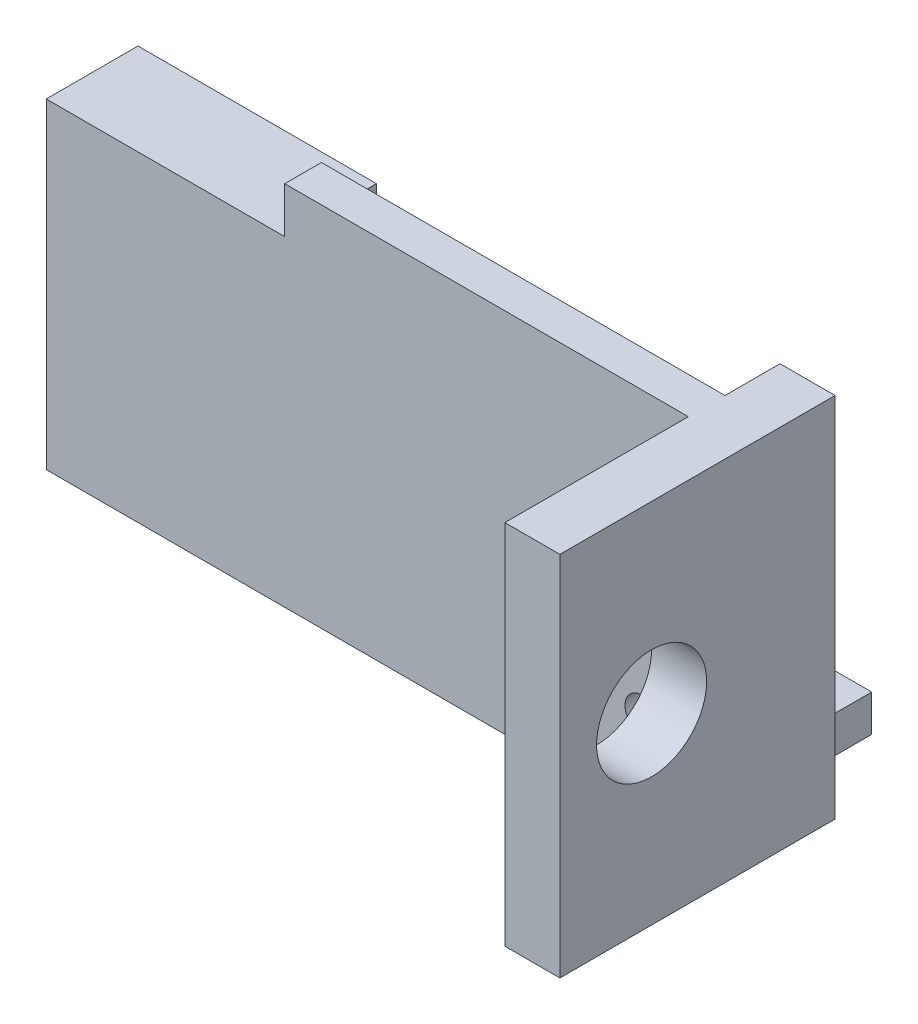
ISO-10303-21;
HEADER;
FILE_DESCRIPTION(('STEP AP214'),'2;1');
FILE_NAME('part.step','',(''),(''),'','','');
FILE_SCHEMA(('AUTOMOTIVE_DESIGN { 1 0 10303 214 1 1 1 1 }'));
ENDSEC;
DATA;
#1=APPLICATION_CONTEXT('core data for automotive mechanical design processes');
#2=APPLICATION_PROTOCOL_DEFINITION('international standard','automotive_design',2000,#1);
#3=PRODUCT_CONTEXT('',#1,'mechanical');
#4=PRODUCT('Part','Part','',(#3));
#5=PRODUCT_RELATED_PRODUCT_CATEGORY('part','',(#4));
#6=PRODUCT_DEFINITION_FORMATION('','',#4);
#7=PRODUCT_DEFINITION_CONTEXT('part definition',#1,'design');
#8=PRODUCT_DEFINITION('design','',#6,#7);
#9=PRODUCT_DEFINITION_SHAPE('','',#8);
#10=(LENGTH_UNIT() NAMED_UNIT(*) SI_UNIT(.MILLI.,.METRE.));
#11=(NAMED_UNIT(*) PLANE_ANGLE_UNIT() SI_UNIT($,.RADIAN.));
#12=(NAMED_UNIT(*) SI_UNIT($,.STERADIAN.) SOLID_ANGLE_UNIT());
#13=UNCERTAINTY_MEASURE_WITH_UNIT(LENGTH_MEASURE(1.E-05),#10,'distance_accuracy_value','');
#14=(GEOMETRIC_REPRESENTATION_CONTEXT(3) GLOBAL_UNCERTAINTY_ASSIGNED_CONTEXT((#13)) GLOBAL_UNIT_ASSIGNED_CONTEXT((#10,
#11,#12)) REPRESENTATION_CONTEXT('',''));
#15=CARTESIAN_POINT('',(0.,0.,0.));
#16=DIRECTION('',(0.,0.,1.));
#17=DIRECTION('',(1.,0.,0.));
#18=AXIS2_PLACEMENT_3D('',#15,#16,#17);
#19=CARTESIAN_POINT('',(17.5,9.,2.));
#20=DIRECTION('',(-1.,0.,0.));
#21=DIRECTION('',(0.,0.,1.));
#22=AXIS2_PLACEMENT_3D('',#19,#20,#21);
#23=PLANE('',#22);
#24=DIRECTION('',(0.,1.,0.));
#25=VECTOR('',#24,1.);
#26=CARTESIAN_POINT('',(17.5,9.,-3.));
#27=LINE('',#26,#25);
#28=CARTESIAN_POINT('',(17.5,-11.,-3.));
#29=VERTEX_POINT('',#28);
#30=CARTESIAN_POINT('',(17.5,-9.,-3.));
#31=VERTEX_POINT('',#30);
#32=EDGE_CURVE('E262',#29,#31,#27,.T.);
#33=ORIENTED_EDGE('',*,*,#32,.F.);
#34=DIRECTION('',(0.,0.,1.));
#35=VECTOR('',#34,1.);
#36=CARTESIAN_POINT('',(17.5,-11.,2.));
#37=LINE('',#36,#35);
#38=CARTESIAN_POINT('',(17.5,-11.,-8.));
#39=VERTEX_POINT('',#38);
#40=EDGE_CURVE('E222',#39,#29,#37,.T.);
#41=ORIENTED_EDGE('',*,*,#40,.F.);
#42=DIRECTION('',(0.,1.,0.));
#43=VECTOR('',#42,1.);
#44=CARTESIAN_POINT('',(17.5,-11.,-8.));
#45=LINE('',#44,#43);
#46=CARTESIAN_POINT('',(17.5,-9.,-8.));
#47=VERTEX_POINT('',#46);
#48=EDGE_CURVE('E215',#39,#47,#45,.T.);
#49=ORIENTED_EDGE('',*,*,#48,.T.);
#50=DIRECTION('',(0.,0.,1.));
#51=VECTOR('',#50,1.);
#52=CARTESIAN_POINT('',(17.5,-9.,2.));
#53=LINE('',#52,#51);
#54=EDGE_CURVE('E226',#47,#31,#53,.T.);
#55=ORIENTED_EDGE('',*,*,#54,.T.);
#56=EDGE_LOOP('',(#33,#41,#49,#55));
#57=FACE_BOUND('',#56,.T.);
#58=ADVANCED_FACE('F41',(#57),#23,.F.);
#59=CARTESIAN_POINT('',(0.,0.,0.));
#60=DIRECTION('',(0.,0.,1.));
#61=DIRECTION('',(1.,0.,0.));
#62=AXIS2_PLACEMENT_3D('',#59,#60,#61);
#63=PLANE('',#62);
#64=DIRECTION('',(0.,-1.,0.));
#65=VECTOR('',#64,1.);
#66=CARTESIAN_POINT('',(-4.5,6.5,0.));
#67=LINE('',#66,#65);
#68=CARTESIAN_POINT('',(-4.5,6.5,0.));
#69=VERTEX_POINT('',#68);
#70=CARTESIAN_POINT('',(-4.5,3.,0.));
#71=VERTEX_POINT('',#70);
#72=EDGE_CURVE('E144',#69,#71,#67,.T.);
#73=ORIENTED_EDGE('',*,*,#72,.F.);
#74=DIRECTION('',(0.,-1.,0.));
#75=VECTOR('',#74,1.);
#76=CARTESIAN_POINT('',(-4.5,6.5,0.));
#77=LINE('',#76,#75);
#78=CARTESIAN_POINT('',(-4.5,9.,0.));
#79=VERTEX_POINT('',#78);
#80=EDGE_CURVE('E185',#79,#69,#77,.T.);
#81=ORIENTED_EDGE('',*,*,#80,.F.);
#82=DIRECTION('',(-1.,0.,0.));
#83=VECTOR('',#82,1.);
#84=CARTESIAN_POINT('',(-4.5,9.,0.));
#85=LINE('',#84,#83);
#86=CARTESIAN_POINT('',(17.5,9.,0.));
#87=VERTEX_POINT('',#86);
#88=EDGE_CURVE('E76',#87,#79,#85,.T.);
#89=ORIENTED_EDGE('',*,*,#88,.F.);
#90=DIRECTION('',(0.,1.,0.));
#91=VECTOR('',#90,1.);
#92=CARTESIAN_POINT('',(17.5,9.,0.));
#93=LINE('',#92,#91);
#94=CARTESIAN_POINT('',(17.5,-4.,0.));
#95=VERTEX_POINT('',#94);
#96=EDGE_CURVE('E171',#95,#87,#93,.T.);
#97=ORIENTED_EDGE('',*,*,#96,.F.);
#98=DIRECTION('',(1.,0.,0.));
#99=VECTOR('',#98,1.);
#100=CARTESIAN_POINT('',(17.5,-4.,0.));
#101=LINE('',#100,#99);
#102=CARTESIAN_POINT('',(9.50000000000001,-4.,0.));
#103=VERTEX_POINT('',#102);
#104=EDGE_CURVE('E98',#103,#95,#101,.T.);
#105=ORIENTED_EDGE('',*,*,#104,.F.);
#106=DIRECTION('',(0.,1.,0.));
#107=VECTOR('',#106,1.);
#108=CARTESIAN_POINT('',(9.50000000000001,-9.,0.));
#109=LINE('',#108,#107);
#110=CARTESIAN_POINT('',(9.50000000000001,-9.,0.));
#111=VERTEX_POINT('',#110);
#112=EDGE_CURVE('E151',#111,#103,#109,.T.);
#113=ORIENTED_EDGE('',*,*,#112,.F.);
#114=DIRECTION('',(1.,0.,0.));
#115=VECTOR('',#114,1.);
#116=CARTESIAN_POINT('',(-17.5,-9.,0.));
#117=LINE('',#116,#115);
#118=CARTESIAN_POINT('',(-17.5,-9.,0.));
#119=VERTEX_POINT('',#118);
#120=EDGE_CURVE('E176',#119,#111,#117,.T.);
#121=ORIENTED_EDGE('',*,*,#120,.F.);
#122=DIRECTION('',(0.,-1.,0.));
#123=VECTOR('',#122,1.);
#124=CARTESIAN_POINT('',(-17.5,6.5,0.));
#125=LINE('',#124,#123);
#126=CARTESIAN_POINT('',(-17.5,3.,0.));
#127=VERTEX_POINT('',#126);
#128=EDGE_CURVE('E188',#127,#119,#125,.T.);
#129=ORIENTED_EDGE('',*,*,#128,.F.);
#130=DIRECTION('',(-1.,0.,0.));
#131=VECTOR('',#130,1.);
#132=CARTESIAN_POINT('',(-17.5,3.,0.));
#133=LINE('',#132,#131);
#134=EDGE_CURVE('E142',#71,#127,#133,.T.);
#135=ORIENTED_EDGE('',*,*,#134,.F.);
#136=EDGE_LOOP('',(#73,#81,#89,#97,#105,#113,#121,#129,#135));
#137=FACE_BOUND('',#136,.T.);
#138=ADVANCED_FACE('F196',(#137),#63,.F.);
#139=CARTESIAN_POINT('',(0.,0.,2.));
#140=DIRECTION('',(0.,0.,1.));
#141=DIRECTION('',(1.,0.,0.));
#142=AXIS2_PLACEMENT_3D('',#139,#140,#141);
#143=PLANE('',#142);
#144=DIRECTION('',(0.,1.,0.));
#145=VECTOR('',#144,1.);
#146=CARTESIAN_POINT('',(17.5,9.,2.));
#147=LINE('',#146,#145);
#148=CARTESIAN_POINT('',(17.5,-11.,2.));
#149=VERTEX_POINT('',#148);
#150=CARTESIAN_POINT('',(17.5,9.,2.));
#151=VERTEX_POINT('',#150);
#152=EDGE_CURVE('E172',#149,#151,#147,.T.);
#153=ORIENTED_EDGE('',*,*,#152,.T.);
#154=DIRECTION('',(-1.,0.,0.));
#155=VECTOR('',#154,1.);
#156=CARTESIAN_POINT('',(-4.5,9.,2.));
#157=LINE('',#156,#155);
#158=CARTESIAN_POINT('',(-4.5,9.,2.));
#159=VERTEX_POINT('',#158);
#160=EDGE_CURVE('E175',#151,#159,#157,.T.);
#161=ORIENTED_EDGE('',*,*,#160,.T.);
#162=DIRECTION('',(0.,-1.,0.));
#163=VECTOR('',#162,1.);
#164=CARTESIAN_POINT('',(-4.5,6.5,2.));
#165=LINE('',#164,#163);
#166=CARTESIAN_POINT('',(-4.5,6.5,2.));
#167=VERTEX_POINT('',#166);
#168=EDGE_CURVE('E178',#159,#167,#165,.T.);
#169=ORIENTED_EDGE('',*,*,#168,.T.);
#170=DIRECTION('',(-1.,0.,0.));
#171=VECTOR('',#170,1.);
#172=CARTESIAN_POINT('',(-17.5,6.5,2.));
#173=LINE('',#172,#171);
#174=CARTESIAN_POINT('',(-17.5,6.5,2.));
#175=VERTEX_POINT('',#174);
#176=EDGE_CURVE('E64',#167,#175,#173,.T.);
#177=ORIENTED_EDGE('',*,*,#176,.T.);
#178=DIRECTION('',(0.,-1.,0.));
#179=VECTOR('',#178,1.);
#180=CARTESIAN_POINT('',(-17.5,6.5,2.));
#181=LINE('',#180,#179);
#182=CARTESIAN_POINT('',(-17.5,-11.,2.));
#183=VERTEX_POINT('',#182);
#184=EDGE_CURVE('E130',#175,#183,#181,.T.);
#185=ORIENTED_EDGE('',*,*,#184,.T.);
#186=DIRECTION('',(-1.,0.,0.));
#187=VECTOR('',#186,1.);
#188=CARTESIAN_POINT('',(17.5,-11.,2.));
#189=LINE('',#188,#187);
#190=EDGE_CURVE('E235',#149,#183,#189,.T.);
#191=ORIENTED_EDGE('',*,*,#190,.F.);
#192=EDGE_LOOP('',(#153,#161,#169,#177,#185,#191));
#193=FACE_BOUND('',#192,.T.);
#194=CARTESIAN_POINT('',(15.,-6.35,2.));
#195=DIRECTION('',(0.,0.,1.));
#196=DIRECTION('',(1.,0.,0.));
#197=AXIS2_PLACEMENT_3D('',#194,#195,#196);
#198=CIRCLE('',#197,0.950000000000001);
#199=CARTESIAN_POINT('',(15.95,-6.35,2.));
#200=VERTEX_POINT('',#199);
#201=EDGE_CURVE('E168',#200,#200,#198,.T.);
#202=ORIENTED_EDGE('',*,*,#201,.F.);
#203=EDGE_LOOP('',(#202));
#204=FACE_BOUND('',#203,.T.);
#205=ADVANCED_FACE('F373',(#193,#204),#143,.T.);
#206=CARTESIAN_POINT('',(-4.5,9.,2.));
#207=DIRECTION('',(0.,-1.,0.));
#208=DIRECTION('',(1.,0.,0.));
#209=AXIS2_PLACEMENT_3D('',#206,#207,#208);
#210=PLANE('',#209);
#211=ORIENTED_EDGE('',*,*,#88,.T.);
#212=DIRECTION('',(0.,0.,-1.));
#213=VECTOR('',#212,1.);
#214=CARTESIAN_POINT('',(-4.5,9.,2.));
#215=LINE('',#214,#213);
#216=EDGE_CURVE('E11',#159,#79,#215,.T.);
#217=ORIENTED_EDGE('',*,*,#216,.F.);
#218=ORIENTED_EDGE('',*,*,#160,.F.);
#219=DIRECTION('',(0.,0.,1.));
#220=VECTOR('',#219,1.);
#221=CARTESIAN_POINT('',(17.5,9.,-3.));
#222=LINE('',#221,#220);
#223=CARTESIAN_POINT('',(17.5,8.99999999999999,12.));
#224=VERTEX_POINT('',#223);
#225=EDGE_CURVE('E261',#151,#224,#222,.T.);
#226=ORIENTED_EDGE('',*,*,#225,.T.);
#227=DIRECTION('',(-1.,0.,0.));
#228=VECTOR('',#227,1.);
#229=CARTESIAN_POINT('',(20.5,8.99999999999999,12.));
#230=LINE('',#229,#228);
#231=CARTESIAN_POINT('',(20.5,8.99999999999999,12.));
#232=VERTEX_POINT('',#231);
#233=EDGE_CURVE('E242',#232,#224,#230,.T.);
#234=ORIENTED_EDGE('',*,*,#233,.F.);
#235=DIRECTION('',(0.,0.,1.));
#236=VECTOR('',#235,1.);
#237=CARTESIAN_POINT('',(20.5,9.,-3.));
#238=LINE('',#237,#236);
#239=CARTESIAN_POINT('',(20.5,9.,-3.));
#240=VERTEX_POINT('',#239);
#241=EDGE_CURVE('E271',#240,#232,#238,.T.);
#242=ORIENTED_EDGE('',*,*,#241,.F.);
#243=DIRECTION('',(-1.,0.,0.));
#244=VECTOR('',#243,1.);
#245=CARTESIAN_POINT('',(20.5,9.,-3.));
#246=LINE('',#245,#244);
#247=CARTESIAN_POINT('',(17.5,9.,-3.));
#248=VERTEX_POINT('',#247);
#249=EDGE_CURVE('E229',#240,#248,#246,.T.);
#250=ORIENTED_EDGE('',*,*,#249,.T.);
#251=EDGE_CURVE('E259',#248,#87,#222,.T.);
#252=ORIENTED_EDGE('',*,*,#251,.T.);
#253=EDGE_LOOP('',(#211,#217,#218,#226,#234,#242,#250,#252));
#254=FACE_BOUND('',#253,.T.);
#255=ADVANCED_FACE('F300',(#254),#210,.F.);
#256=CARTESIAN_POINT('',(-4.5,6.5,2.));
#257=DIRECTION('',(1.,0.,0.));
#258=DIRECTION('',(0.,0.,-1.));
#259=AXIS2_PLACEMENT_3D('',#256,#257,#258);
#260=PLANE('',#259);
#261=ORIENTED_EDGE('',*,*,#80,.T.);
#262=DIRECTION('',(0.,0.,-1.));
#263=VECTOR('',#262,1.);
#264=CARTESIAN_POINT('',(-4.5,6.5,2.));
#265=LINE('',#264,#263);
#266=EDGE_CURVE('E48',#167,#69,#265,.T.);
#267=ORIENTED_EDGE('',*,*,#266,.F.);
#268=ORIENTED_EDGE('',*,*,#168,.F.);
#269=ORIENTED_EDGE('',*,*,#216,.T.);
#270=EDGE_LOOP('',(#261,#267,#268,#269));
#271=FACE_BOUND('',#270,.T.);
#272=ADVANCED_FACE('F194',(#271),#260,.F.);
#273=CARTESIAN_POINT('',(-17.5,6.5,2.));
#274=DIRECTION('',(0.,-1.,0.));
#275=DIRECTION('',(0.,0.,-1.));
#276=AXIS2_PLACEMENT_3D('',#273,#274,#275);
#277=PLANE('',#276);
#278=ORIENTED_EDGE('',*,*,#266,.T.);
#279=DIRECTION('',(0.,0.,1.));
#280=VECTOR('',#279,1.);
#281=CARTESIAN_POINT('',(-4.5,6.5,-3.));
#282=LINE('',#281,#280);
#283=CARTESIAN_POINT('',(-4.5,6.5,-3.));
#284=VERTEX_POINT('',#283);
#285=EDGE_CURVE('E107',#284,#69,#282,.T.);
#286=ORIENTED_EDGE('',*,*,#285,.F.);
#287=DIRECTION('',(1.,0.,0.));
#288=VECTOR('',#287,1.);
#289=CARTESIAN_POINT('',(-17.5,6.5,-3.));
#290=LINE('',#289,#288);
#291=CARTESIAN_POINT('',(-17.5,6.5,-3.));
#292=VERTEX_POINT('',#291);
#293=EDGE_CURVE('E133',#292,#284,#290,.T.);
#294=ORIENTED_EDGE('',*,*,#293,.F.);
#295=DIRECTION('',(0.,0.,-1.));
#296=VECTOR('',#295,1.);
#297=CARTESIAN_POINT('',(-17.5,6.5,2.));
#298=LINE('',#297,#296);
#299=EDGE_CURVE('E124',#175,#292,#298,.T.);
#300=ORIENTED_EDGE('',*,*,#299,.F.);
#301=ORIENTED_EDGE('',*,*,#176,.F.);
#302=EDGE_LOOP('',(#278,#286,#294,#300,#301));
#303=FACE_BOUND('',#302,.T.);
#304=ADVANCED_FACE('F135',(#303),#277,.F.);
#305=CARTESIAN_POINT('',(-17.5,6.5,2.));
#306=DIRECTION('',(1.,0.,0.));
#307=DIRECTION('',(0.,1.,0.));
#308=AXIS2_PLACEMENT_3D('',#305,#306,#307);
#309=PLANE('',#308);
#310=ORIENTED_EDGE('',*,*,#299,.T.);
#311=DIRECTION('',(0.,1.,0.));
#312=VECTOR('',#311,1.);
#313=CARTESIAN_POINT('',(-17.5,6.5,-3.));
#314=LINE('',#313,#312);
#315=CARTESIAN_POINT('',(-17.5,3.,-3.));
#316=VERTEX_POINT('',#315);
#317=EDGE_CURVE('E128',#316,#292,#314,.T.);
#318=ORIENTED_EDGE('',*,*,#317,.F.);
#319=DIRECTION('',(0.,0.,1.));
#320=VECTOR('',#319,1.);
#321=CARTESIAN_POINT('',(-17.5,3.,-3.));
#322=LINE('',#321,#320);
#323=EDGE_CURVE('E55',#316,#127,#322,.T.);
#324=ORIENTED_EDGE('',*,*,#323,.T.);
#325=ORIENTED_EDGE('',*,*,#128,.T.);
#326=DIRECTION('',(0.,0.,-1.));
#327=VECTOR('',#326,1.);
#328=CARTESIAN_POINT('',(-17.5,-9.,2.));
#329=LINE('',#328,#327);
#330=CARTESIAN_POINT('',(-17.5,-9.,-8.));
#331=VERTEX_POINT('',#330);
#332=EDGE_CURVE('E223',#119,#331,#329,.T.);
#333=ORIENTED_EDGE('',*,*,#332,.T.);
#334=DIRECTION('',(0.,1.,0.));
#335=VECTOR('',#334,1.);
#336=CARTESIAN_POINT('',(-17.5,-11.,-8.));
#337=LINE('',#336,#335);
#338=CARTESIAN_POINT('',(-17.5,-11.,-8.));
#339=VERTEX_POINT('',#338);
#340=EDGE_CURVE('E212',#339,#331,#337,.T.);
#341=ORIENTED_EDGE('',*,*,#340,.F.);
#342=DIRECTION('',(0.,0.,-1.));
#343=VECTOR('',#342,1.);
#344=CARTESIAN_POINT('',(-17.5,-11.,2.));
#345=LINE('',#344,#343);
#346=EDGE_CURVE('E232',#183,#339,#345,.T.);
#347=ORIENTED_EDGE('',*,*,#346,.F.);
#348=ORIENTED_EDGE('',*,*,#184,.F.);
#349=EDGE_LOOP('',(#310,#318,#324,#325,#333,#341,#347,#348));
#350=FACE_BOUND('',#349,.T.);
#351=ADVANCED_FACE('F126',(#350),#309,.F.);
#352=CARTESIAN_POINT('',(15.,-6.35,2.));
#353=DIRECTION('',(0.,0.,-1.));
#354=DIRECTION('',(-1.,0.,0.));
#355=AXIS2_PLACEMENT_3D('',#352,#353,#354);
#356=CYLINDRICAL_SURFACE('',#355,0.950000000000001);
#357=ORIENTED_EDGE('',*,*,#201,.T.);
#358=EDGE_LOOP('',(#357));
#359=FACE_BOUND('',#358,.T.);
#360=CARTESIAN_POINT('',(15.,-6.35,-3.));
#361=DIRECTION('',(0.,0.,-1.));
#362=DIRECTION('',(-1.,0.,0.));
#363=AXIS2_PLACEMENT_3D('',#360,#361,#362);
#364=CIRCLE('',#363,0.949999999999999);
#365=CARTESIAN_POINT('',(14.05,-6.35,-3.));
#366=VERTEX_POINT('',#365);
#367=EDGE_CURVE('E148',#366,#366,#364,.T.);
#368=ORIENTED_EDGE('',*,*,#367,.T.);
#369=EDGE_LOOP('',(#368));
#370=FACE_BOUND('',#369,.T.);
#371=ADVANCED_FACE('F393',(#359,#370),#356,.F.);
#372=CARTESIAN_POINT('',(0.,0.,-3.));
#373=DIRECTION('',(0.,0.,1.));
#374=DIRECTION('',(1.,0.,0.));
#375=AXIS2_PLACEMENT_3D('',#372,#373,#374);
#376=PLANE('',#375);
#377=DIRECTION('',(1.,0.,0.));
#378=VECTOR('',#377,1.);
#379=CARTESIAN_POINT('',(17.5,-4.,-3.));
#380=LINE('',#379,#378);
#381=CARTESIAN_POINT('',(9.50000000000001,-4.,-3.));
#382=VERTEX_POINT('',#381);
#383=CARTESIAN_POINT('',(17.5,-4.,-3.));
#384=VERTEX_POINT('',#383);
#385=EDGE_CURVE('E155',#382,#384,#380,.T.);
#386=ORIENTED_EDGE('',*,*,#385,.T.);
#387=EDGE_CURVE('E265',#384,#248,#27,.T.);
#388=ORIENTED_EDGE('',*,*,#387,.T.);
#389=ORIENTED_EDGE('',*,*,#249,.F.);
#390=DIRECTION('',(0.,1.,0.));
#391=VECTOR('',#390,1.);
#392=CARTESIAN_POINT('',(20.5,9.,-3.));
#393=LINE('',#392,#391);
#394=CARTESIAN_POINT('',(20.5,-11.,-3.));
#395=VERTEX_POINT('',#394);
#396=EDGE_CURVE('E255',#395,#240,#393,.T.);
#397=ORIENTED_EDGE('',*,*,#396,.F.);
#398=DIRECTION('',(-1.,0.,0.));
#399=VECTOR('',#398,1.);
#400=CARTESIAN_POINT('',(20.5,-11.,-3.));
#401=LINE('',#400,#399);
#402=EDGE_CURVE('E248',#395,#29,#401,.T.);
#403=ORIENTED_EDGE('',*,*,#402,.T.);
#404=ORIENTED_EDGE('',*,*,#32,.T.);
#405=DIRECTION('',(-1.,0.,0.));
#406=VECTOR('',#405,1.);
#407=CARTESIAN_POINT('',(17.5,-9.,-3.));
#408=LINE('',#407,#406);
#409=CARTESIAN_POINT('',(9.50000000000001,-9.,-3.));
#410=VERTEX_POINT('',#409);
#411=EDGE_CURVE('E152',#31,#410,#408,.T.);
#412=ORIENTED_EDGE('',*,*,#411,.T.);
#413=DIRECTION('',(0.,1.,0.));
#414=VECTOR('',#413,1.);
#415=CARTESIAN_POINT('',(9.50000000000001,-9.,-3.));
#416=LINE('',#415,#414);
#417=EDGE_CURVE('E85',#410,#382,#416,.T.);
#418=ORIENTED_EDGE('',*,*,#417,.T.);
#419=EDGE_LOOP('',(#386,#388,#389,#397,#403,#404,#412,#418));
#420=FACE_BOUND('',#419,.T.);
#421=ORIENTED_EDGE('',*,*,#367,.F.);
#422=EDGE_LOOP('',(#421));
#423=FACE_BOUND('',#422,.T.);
#424=ADVANCED_FACE('F288',(#420,#423),#376,.F.);
#425=CARTESIAN_POINT('',(9.50000000000001,-9.,-3.));
#426=DIRECTION('',(1.,0.,0.));
#427=DIRECTION('',(0.,0.,-1.));
#428=AXIS2_PLACEMENT_3D('',#425,#426,#427);
#429=PLANE('',#428);
#430=ORIENTED_EDGE('',*,*,#112,.T.);
#431=DIRECTION('',(0.,0.,1.));
#432=VECTOR('',#431,1.);
#433=CARTESIAN_POINT('',(9.50000000000001,-4.,-3.));
#434=LINE('',#433,#432);
#435=EDGE_CURVE('E162',#382,#103,#434,.T.);
#436=ORIENTED_EDGE('',*,*,#435,.F.);
#437=ORIENTED_EDGE('',*,*,#417,.F.);
#438=DIRECTION('',(0.,0.,1.));
#439=VECTOR('',#438,1.);
#440=CARTESIAN_POINT('',(9.50000000000001,-9.,-3.));
#441=LINE('',#440,#439);
#442=EDGE_CURVE('E165',#410,#111,#441,.T.);
#443=ORIENTED_EDGE('',*,*,#442,.T.);
#444=EDGE_LOOP('',(#430,#436,#437,#443));
#445=FACE_BOUND('',#444,.T.);
#446=ADVANCED_FACE('F353',(#445),#429,.F.);
#447=CARTESIAN_POINT('',(17.5,-4.,-3.));
#448=DIRECTION('',(0.,-1.,0.));
#449=DIRECTION('',(0.,0.,-1.));
#450=AXIS2_PLACEMENT_3D('',#447,#448,#449);
#451=PLANE('',#450);
#452=ORIENTED_EDGE('',*,*,#104,.T.);
#453=DIRECTION('',(0.,0.,1.));
#454=VECTOR('',#453,1.);
#455=CARTESIAN_POINT('',(17.5,-4.,-3.));
#456=LINE('',#455,#454);
#457=EDGE_CURVE('E157',#384,#95,#456,.T.);
#458=ORIENTED_EDGE('',*,*,#457,.F.);
#459=ORIENTED_EDGE('',*,*,#385,.F.);
#460=ORIENTED_EDGE('',*,*,#435,.T.);
#461=EDGE_LOOP('',(#452,#458,#459,#460));
#462=FACE_BOUND('',#461,.T.);
#463=ADVANCED_FACE('F355',(#462),#451,.F.);
#464=CARTESIAN_POINT('',(-4.5,6.5,-3.));
#465=DIRECTION('',(-1.,0.,0.));
#466=DIRECTION('',(0.,0.,1.));
#467=AXIS2_PLACEMENT_3D('',#464,#465,#466);
#468=PLANE('',#467);
#469=ORIENTED_EDGE('',*,*,#72,.T.);
#470=DIRECTION('',(0.,0.,1.));
#471=VECTOR('',#470,1.);
#472=CARTESIAN_POINT('',(-4.5,3.,-3.));
#473=LINE('',#472,#471);
#474=CARTESIAN_POINT('',(-4.5,3.,-3.));
#475=VERTEX_POINT('',#474);
#476=EDGE_CURVE('E205',#475,#71,#473,.T.);
#477=ORIENTED_EDGE('',*,*,#476,.F.);
#478=DIRECTION('',(0.,-1.,0.));
#479=VECTOR('',#478,1.);
#480=CARTESIAN_POINT('',(-4.5,6.5,-3.));
#481=LINE('',#480,#479);
#482=EDGE_CURVE('E137',#284,#475,#481,.T.);
#483=ORIENTED_EDGE('',*,*,#482,.F.);
#484=ORIENTED_EDGE('',*,*,#285,.T.);
#485=EDGE_LOOP('',(#469,#477,#483,#484));
#486=FACE_BOUND('',#485,.T.);
#487=ADVANCED_FACE('F206',(#486),#468,.F.);
#488=CARTESIAN_POINT('',(-17.5,3.,-3.));
#489=DIRECTION('',(0.,1.,0.));
#490=DIRECTION('',(-1.,0.,0.));
#491=AXIS2_PLACEMENT_3D('',#488,#489,#490);
#492=PLANE('',#491);
#493=ORIENTED_EDGE('',*,*,#134,.T.);
#494=ORIENTED_EDGE('',*,*,#323,.F.);
#495=DIRECTION('',(-1.,0.,0.));
#496=VECTOR('',#495,1.);
#497=CARTESIAN_POINT('',(-17.5,3.,-3.));
#498=LINE('',#497,#496);
#499=EDGE_CURVE('E141',#475,#316,#498,.T.);
#500=ORIENTED_EDGE('',*,*,#499,.F.);
#501=ORIENTED_EDGE('',*,*,#476,.T.);
#502=EDGE_LOOP('',(#493,#494,#500,#501));
#503=FACE_BOUND('',#502,.T.);
#504=ADVANCED_FACE('F209',(#503),#492,.F.);
#505=CARTESIAN_POINT('',(0.,0.,-3.));
#506=DIRECTION('',(0.,0.,1.));
#507=DIRECTION('',(1.,0.,0.));
#508=AXIS2_PLACEMENT_3D('',#505,#506,#507);
#509=PLANE('',#508);
#510=ORIENTED_EDGE('',*,*,#317,.T.);
#511=ORIENTED_EDGE('',*,*,#293,.T.);
#512=ORIENTED_EDGE('',*,*,#482,.T.);
#513=ORIENTED_EDGE('',*,*,#499,.T.);
#514=EDGE_LOOP('',(#510,#511,#512,#513));
#515=FACE_BOUND('',#514,.T.);
#516=ADVANCED_FACE('F139',(#515),#509,.F.);
#517=CARTESIAN_POINT('',(17.5,-11.,-8.));
#518=DIRECTION('',(0.,0.,1.));
#519=DIRECTION('',(1.,0.,0.));
#520=AXIS2_PLACEMENT_3D('',#517,#518,#519);
#521=PLANE('',#520);
#522=DIRECTION('',(1.,0.,0.));
#523=VECTOR('',#522,1.);
#524=CARTESIAN_POINT('',(17.5,-9.,-8.));
#525=LINE('',#524,#523);
#526=EDGE_CURVE('E219',#331,#47,#525,.T.);
#527=ORIENTED_EDGE('',*,*,#526,.T.);
#528=ORIENTED_EDGE('',*,*,#48,.F.);
#529=DIRECTION('',(1.,0.,0.));
#530=VECTOR('',#529,1.);
#531=CARTESIAN_POINT('',(17.5,-11.,-8.));
#532=LINE('',#531,#530);
#533=EDGE_CURVE('E218',#339,#39,#532,.T.);
#534=ORIENTED_EDGE('',*,*,#533,.F.);
#535=ORIENTED_EDGE('',*,*,#340,.T.);
#536=EDGE_LOOP('',(#527,#528,#534,#535));
#537=FACE_BOUND('',#536,.T.);
#538=ADVANCED_FACE('F383',(#537),#521,.F.);
#539=CARTESIAN_POINT('',(0.,-11.,0.));
#540=DIRECTION('',(0.,1.,0.));
#541=DIRECTION('',(0.,0.,1.));
#542=AXIS2_PLACEMENT_3D('',#539,#540,#541);
#543=PLANE('',#542);
#544=ORIENTED_EDGE('',*,*,#40,.T.);
#545=ORIENTED_EDGE('',*,*,#402,.F.);
#546=DIRECTION('',(0.,0.,-1.));
#547=VECTOR('',#546,1.);
#548=CARTESIAN_POINT('',(20.5,-11.,-3.));
#549=LINE('',#548,#547);
#550=CARTESIAN_POINT('',(20.5,-11.,12.));
#551=VERTEX_POINT('',#550);
#552=EDGE_CURVE('E251',#551,#395,#549,.T.);
#553=ORIENTED_EDGE('',*,*,#552,.F.);
#554=DIRECTION('',(-1.,0.,0.));
#555=VECTOR('',#554,1.);
#556=CARTESIAN_POINT('',(20.5,-11.,12.));
#557=LINE('',#556,#555);
#558=CARTESIAN_POINT('',(17.5,-11.,12.));
#559=VERTEX_POINT('',#558);
#560=EDGE_CURVE('E245',#551,#559,#557,.T.);
#561=ORIENTED_EDGE('',*,*,#560,.T.);
#562=DIRECTION('',(0.,0.,-1.));
#563=VECTOR('',#562,1.);
#564=CARTESIAN_POINT('',(17.5,-11.,-3.));
#565=LINE('',#564,#563);
#566=EDGE_CURVE('E252',#559,#149,#565,.T.);
#567=ORIENTED_EDGE('',*,*,#566,.T.);
#568=ORIENTED_EDGE('',*,*,#190,.T.);
#569=ORIENTED_EDGE('',*,*,#346,.T.);
#570=ORIENTED_EDGE('',*,*,#533,.T.);
#571=EDGE_LOOP('',(#544,#545,#553,#561,#567,#568,#569,#570));
#572=FACE_BOUND('',#571,.T.);
#573=ADVANCED_FACE('F378',(#572),#543,.F.);
#574=CARTESIAN_POINT('',(0.,-9.,0.));
#575=DIRECTION('',(0.,1.,0.));
#576=DIRECTION('',(0.,0.,1.));
#577=AXIS2_PLACEMENT_3D('',#574,#575,#576);
#578=PLANE('',#577);
#579=ORIENTED_EDGE('',*,*,#332,.F.);
#580=ORIENTED_EDGE('',*,*,#120,.T.);
#581=ORIENTED_EDGE('',*,*,#442,.F.);
#582=ORIENTED_EDGE('',*,*,#411,.F.);
#583=ORIENTED_EDGE('',*,*,#54,.F.);
#584=ORIENTED_EDGE('',*,*,#526,.F.);
#585=EDGE_LOOP('',(#579,#580,#581,#582,#583,#584));
#586=FACE_BOUND('',#585,.T.);
#587=ADVANCED_FACE('F349',(#586),#578,.T.);
#588=CARTESIAN_POINT('',(17.5,0.,0.));
#589=DIRECTION('',(-1.,0.,0.));
#590=DIRECTION('',(0.,0.,1.));
#591=AXIS2_PLACEMENT_3D('',#588,#589,#590);
#592=PLANE('',#591);
#593=CARTESIAN_POINT('',(17.5,-1.,7.));
#594=DIRECTION('',(1.,0.,0.));
#595=DIRECTION('',(0.,0.,-1.));
#596=AXIS2_PLACEMENT_3D('',#593,#594,#595);
#597=CIRCLE('',#596,3.);
#598=CARTESIAN_POINT('',(17.5,-1.,4.));
#599=VERTEX_POINT('',#598);
#600=EDGE_CURVE('E276',#599,#599,#597,.T.);
#601=ORIENTED_EDGE('',*,*,#600,.T.);
#602=EDGE_LOOP('',(#601));
#603=FACE_BOUND('',#602,.T.);
#604=ORIENTED_EDGE('',*,*,#152,.F.);
#605=ORIENTED_EDGE('',*,*,#566,.F.);
#606=DIRECTION('',(0.,-1.,0.));
#607=VECTOR('',#606,1.);
#608=CARTESIAN_POINT('',(17.5,8.99999999999999,12.));
#609=LINE('',#608,#607);
#610=EDGE_CURVE('E256',#224,#559,#609,.T.);
#611=ORIENTED_EDGE('',*,*,#610,.F.);
#612=ORIENTED_EDGE('',*,*,#225,.F.);
#613=EDGE_LOOP('',(#604,#605,#611,#612));
#614=FACE_BOUND('',#613,.T.);
#615=ADVANCED_FACE('F503',(#603,#614),#592,.T.);
#616=CARTESIAN_POINT('',(20.5,0.,0.));
#617=DIRECTION('',(-1.,0.,0.));
#618=DIRECTION('',(0.,0.,1.));
#619=AXIS2_PLACEMENT_3D('',#616,#617,#618);
#620=PLANE('',#619);
#621=ORIENTED_EDGE('',*,*,#396,.T.);
#622=ORIENTED_EDGE('',*,*,#241,.T.);
#623=DIRECTION('',(0.,-1.,0.));
#624=VECTOR('',#623,1.);
#625=CARTESIAN_POINT('',(20.5,8.99999999999999,12.));
#626=LINE('',#625,#624);
#627=EDGE_CURVE('E268',#232,#551,#626,.T.);
#628=ORIENTED_EDGE('',*,*,#627,.T.);
#629=ORIENTED_EDGE('',*,*,#552,.T.);
#630=EDGE_LOOP('',(#621,#622,#628,#629));
#631=FACE_BOUND('',#630,.T.);
#632=CARTESIAN_POINT('',(20.5,-1.,7.));
#633=DIRECTION('',(1.,0.,0.));
#634=DIRECTION('',(0.,0.,-1.));
#635=AXIS2_PLACEMENT_3D('',#632,#633,#634);
#636=CIRCLE('',#635,3.);
#637=CARTESIAN_POINT('',(20.5,-1.,4.));
#638=VERTEX_POINT('',#637);
#639=EDGE_CURVE('E279',#638,#638,#636,.T.);
#640=ORIENTED_EDGE('',*,*,#639,.F.);
#641=EDGE_LOOP('',(#640));
#642=FACE_BOUND('',#641,.T.);
#643=ADVANCED_FACE('F308',(#631,#642),#620,.F.);
#644=ORIENTED_EDGE('',*,*,#387,.F.);
#645=ORIENTED_EDGE('',*,*,#457,.T.);
#646=ORIENTED_EDGE('',*,*,#96,.T.);
#647=ORIENTED_EDGE('',*,*,#251,.F.);
#648=EDGE_LOOP('',(#644,#645,#646,#647));
#649=FACE_BOUND('',#648,.T.);
#650=ADVANCED_FACE('F298',(#649),#592,.T.);
#651=CARTESIAN_POINT('',(20.5,8.99999999999999,12.));
#652=DIRECTION('',(0.,0.,-1.));
#653=DIRECTION('',(0.,1.,0.));
#654=AXIS2_PLACEMENT_3D('',#651,#652,#653);
#655=PLANE('',#654);
#656=ORIENTED_EDGE('',*,*,#610,.T.);
#657=ORIENTED_EDGE('',*,*,#560,.F.);
#658=ORIENTED_EDGE('',*,*,#627,.F.);
#659=ORIENTED_EDGE('',*,*,#233,.T.);
#660=EDGE_LOOP('',(#656,#657,#658,#659));
#661=FACE_BOUND('',#660,.T.);
#662=ADVANCED_FACE('F531',(#661),#655,.F.);
#663=CARTESIAN_POINT('',(20.5,-1.,7.));
#664=DIRECTION('',(-1.,0.,0.));
#665=DIRECTION('',(0.,0.,1.));
#666=AXIS2_PLACEMENT_3D('',#663,#664,#665);
#667=CYLINDRICAL_SURFACE('',#666,3.);
#668=ORIENTED_EDGE('',*,*,#639,.T.);
#669=EDGE_LOOP('',(#668));
#670=FACE_BOUND('',#669,.T.);
#671=ORIENTED_EDGE('',*,*,#600,.F.);
#672=EDGE_LOOP('',(#671));
#673=FACE_BOUND('',#672,.T.);
#674=ADVANCED_FACE('F538',(#670,#673),#667,.F.);
#675=CLOSED_SHELL('',(#58,#138,#205,#255,#272,#304,#351,#371,#424,#446,#463,#487,#504,#516,#538,
#573,#587,#615,#643,#650,#662,#674));
#676=MANIFOLD_SOLID_BREP('B2',#675);
#677=ADVANCED_BREP_SHAPE_REPRESENTATION('',(#18,#676),#14);
#678=SHAPE_DEFINITION_REPRESENTATION(#9,#677);
ENDSEC;
END-ISO-10303-21;
